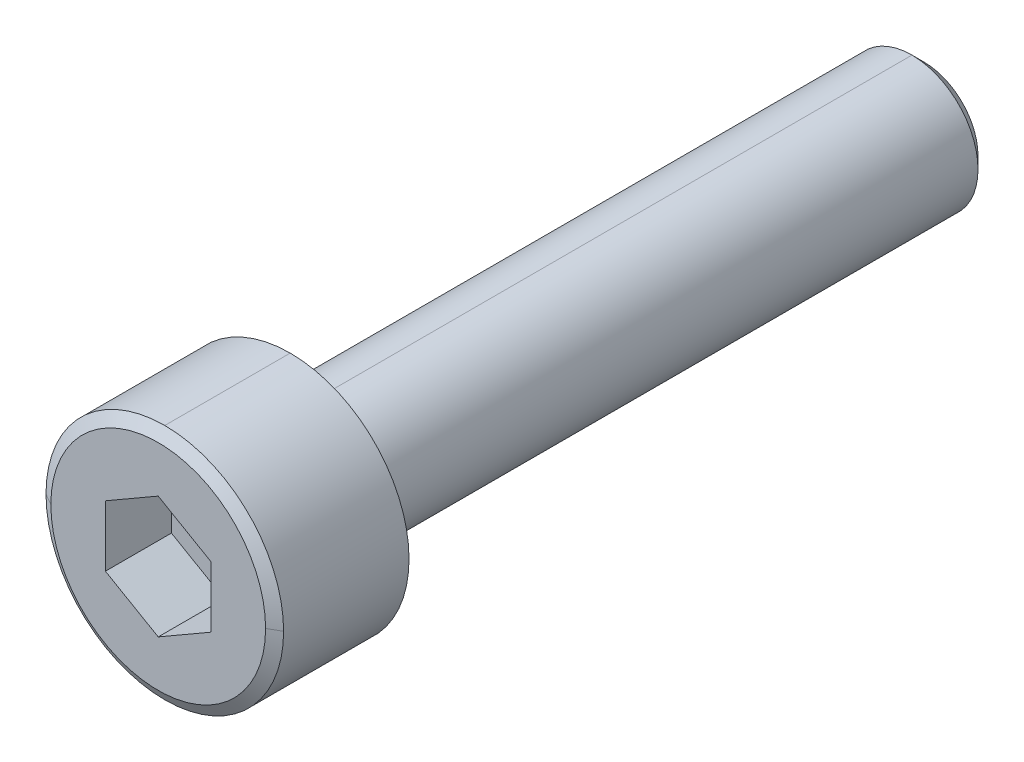
ISO-10303-21;
HEADER;
FILE_DESCRIPTION(('STEP AP214'),'2;1');
FILE_NAME('part.step','',(''),(''),'','','');
FILE_SCHEMA(('AUTOMOTIVE_DESIGN { 1 0 10303 214 1 1 1 1 }'));
ENDSEC;
DATA;
#1=APPLICATION_CONTEXT('core data for automotive mechanical design processes');
#2=APPLICATION_PROTOCOL_DEFINITION('international standard','automotive_design',2000,#1);
#3=PRODUCT_CONTEXT('',#1,'mechanical');
#4=PRODUCT('Part','Part','',(#3));
#5=PRODUCT_RELATED_PRODUCT_CATEGORY('part','',(#4));
#6=PRODUCT_DEFINITION_FORMATION('','',#4);
#7=PRODUCT_DEFINITION_CONTEXT('part definition',#1,'design');
#8=PRODUCT_DEFINITION('design','',#6,#7);
#9=PRODUCT_DEFINITION_SHAPE('','',#8);
#10=(LENGTH_UNIT() NAMED_UNIT(*) SI_UNIT(.MILLI.,.METRE.));
#11=(NAMED_UNIT(*) PLANE_ANGLE_UNIT() SI_UNIT($,.RADIAN.));
#12=(NAMED_UNIT(*) SI_UNIT($,.STERADIAN.) SOLID_ANGLE_UNIT());
#13=UNCERTAINTY_MEASURE_WITH_UNIT(LENGTH_MEASURE(1.E-05),#10,'distance_accuracy_value','');
#14=(GEOMETRIC_REPRESENTATION_CONTEXT(3) GLOBAL_UNCERTAINTY_ASSIGNED_CONTEXT((#13)) GLOBAL_UNIT_ASSIGNED_CONTEXT((#10,
#11,#12)) REPRESENTATION_CONTEXT('',''));
#15=CARTESIAN_POINT('',(0.,0.,0.));
#16=DIRECTION('',(0.,0.,1.));
#17=DIRECTION('',(1.,0.,0.));
#18=AXIS2_PLACEMENT_3D('',#15,#16,#17);
#19=CARTESIAN_POINT('',(0.,0.,1.25));
#20=DIRECTION('',(0.,0.,1.));
#21=DIRECTION('',(1.,0.,0.));
#22=AXIS2_PLACEMENT_3D('',#19,#20,#21);
#23=PLANE('',#22);
#24=DIRECTION('',(0.,-1.,0.));
#25=VECTOR('',#24,1.);
#26=CARTESIAN_POINT('',(-1.,0.5773502691896,1.25));
#27=LINE('',#26,#25);
#28=CARTESIAN_POINT('',(-1.,0.5773502691896,1.25));
#29=VERTEX_POINT('',#28);
#30=CARTESIAN_POINT('',(-1.,-0.5773502691896,1.25));
#31=VERTEX_POINT('',#30);
#32=EDGE_CURVE('E11',#29,#31,#27,.T.);
#33=ORIENTED_EDGE('',*,*,#32,.T.);
#34=DIRECTION('',(0.866025403784429,-0.500000000000017,0.));
#35=VECTOR('',#34,1.);
#36=CARTESIAN_POINT('',(-1.,-0.5773502691896,1.25));
#37=LINE('',#36,#35);
#38=CARTESIAN_POINT('',(0.,-1.154700538379,1.25));
#39=VERTEX_POINT('',#38);
#40=EDGE_CURVE('E167',#31,#39,#37,.T.);
#41=ORIENTED_EDGE('',*,*,#40,.T.);
#42=DIRECTION('',(0.866025403784429,0.500000000000017,0.));
#43=VECTOR('',#42,1.);
#44=CARTESIAN_POINT('',(0.,-1.154700538379,1.25));
#45=LINE('',#44,#43);
#46=CARTESIAN_POINT('',(1.,-0.5773502691896,1.25));
#47=VERTEX_POINT('',#46);
#48=EDGE_CURVE('E243',#39,#47,#45,.T.);
#49=ORIENTED_EDGE('',*,*,#48,.T.);
#50=DIRECTION('',(0.,1.,0.));
#51=VECTOR('',#50,1.);
#52=CARTESIAN_POINT('',(1.,-0.5773502691896,1.25));
#53=LINE('',#52,#51);
#54=CARTESIAN_POINT('',(1.,0.5773502691896,1.25));
#55=VERTEX_POINT('',#54);
#56=EDGE_CURVE('E174',#47,#55,#53,.T.);
#57=ORIENTED_EDGE('',*,*,#56,.T.);
#58=DIRECTION('',(-0.866025403784429,0.500000000000017,0.));
#59=VECTOR('',#58,1.);
#60=CARTESIAN_POINT('',(1.,0.5773502691896,1.25));
#61=LINE('',#60,#59);
#62=CARTESIAN_POINT('',(0.,1.154700538379,1.25));
#63=VERTEX_POINT('',#62);
#64=EDGE_CURVE('E163',#55,#63,#61,.T.);
#65=ORIENTED_EDGE('',*,*,#64,.T.);
#66=DIRECTION('',(-0.866025403784429,-0.500000000000017,0.));
#67=VECTOR('',#66,1.);
#68=CARTESIAN_POINT('',(0.,1.154700538379,1.25));
#69=LINE('',#68,#67);
#70=EDGE_CURVE('E164',#63,#29,#69,.T.);
#71=ORIENTED_EDGE('',*,*,#70,.T.);
#72=EDGE_LOOP('',(#33,#41,#49,#57,#65,#71));
#73=FACE_BOUND('',#72,.T.);
#74=ADVANCED_FACE('F16',(#73),#23,.T.);
#75=CARTESIAN_POINT('',(-1.,0.5773502691896,2.5));
#76=DIRECTION('',(-1.,0.,0.));
#77=DIRECTION('',(0.,0.,1.));
#78=AXIS2_PLACEMENT_3D('',#75,#76,#77);
#79=PLANE('',#78);
#80=DIRECTION('',(0.,0.,-1.));
#81=VECTOR('',#80,1.);
#82=CARTESIAN_POINT('',(-1.,-0.5773502691896,2.5));
#83=LINE('',#82,#81);
#84=CARTESIAN_POINT('',(-1.,-0.5773502691896,2.5));
#85=VERTEX_POINT('',#84);
#86=EDGE_CURVE('E27',#85,#31,#83,.T.);
#87=ORIENTED_EDGE('',*,*,#86,.T.);
#88=ORIENTED_EDGE('',*,*,#32,.F.);
#89=DIRECTION('',(0.,0.,-1.));
#90=VECTOR('',#89,1.);
#91=CARTESIAN_POINT('',(-1.,0.5773502691896,2.5));
#92=LINE('',#91,#90);
#93=CARTESIAN_POINT('',(-1.,0.5773502691896,2.5));
#94=VERTEX_POINT('',#93);
#95=EDGE_CURVE('E230',#94,#29,#92,.T.);
#96=ORIENTED_EDGE('',*,*,#95,.F.);
#97=DIRECTION('',(0.,-1.,0.));
#98=VECTOR('',#97,1.);
#99=CARTESIAN_POINT('',(-1.,0.5773502691896,2.5));
#100=LINE('',#99,#98);
#101=EDGE_CURVE('E183',#94,#85,#100,.T.);
#102=ORIENTED_EDGE('',*,*,#101,.T.);
#103=EDGE_LOOP('',(#87,#88,#96,#102));
#104=FACE_BOUND('',#103,.T.);
#105=ADVANCED_FACE('F349',(#104),#79,.F.);
#106=CARTESIAN_POINT('',(-1.,-0.5773502691896,2.5));
#107=DIRECTION('',(-0.500000000000017,-0.866025403784429,0.));
#108=DIRECTION('',(-0.866025403784429,0.500000000000017,0.));
#109=AXIS2_PLACEMENT_3D('',#106,#107,#108);
#110=PLANE('',#109);
#111=DIRECTION('',(0.,0.,-1.));
#112=VECTOR('',#111,1.);
#113=CARTESIAN_POINT('',(0.,-1.154700538379,2.5));
#114=LINE('',#113,#112);
#115=CARTESIAN_POINT('',(0.,-1.154700538379,2.5));
#116=VERTEX_POINT('',#115);
#117=EDGE_CURVE('E246',#116,#39,#114,.T.);
#118=ORIENTED_EDGE('',*,*,#117,.T.);
#119=ORIENTED_EDGE('',*,*,#40,.F.);
#120=ORIENTED_EDGE('',*,*,#86,.F.);
#121=DIRECTION('',(0.866025403784429,-0.500000000000017,0.));
#122=VECTOR('',#121,1.);
#123=CARTESIAN_POINT('',(-1.,-0.5773502691896,2.5));
#124=LINE('',#123,#122);
#125=EDGE_CURVE('E179',#85,#116,#124,.T.);
#126=ORIENTED_EDGE('',*,*,#125,.T.);
#127=EDGE_LOOP('',(#118,#119,#120,#126));
#128=FACE_BOUND('',#127,.T.);
#129=ADVANCED_FACE('F354',(#128),#110,.F.);
#130=CARTESIAN_POINT('',(0.,-1.154700538379,2.5));
#131=DIRECTION('',(0.500000000000017,-0.866025403784429,0.));
#132=DIRECTION('',(0.,0.,-1.));
#133=AXIS2_PLACEMENT_3D('',#130,#131,#132);
#134=PLANE('',#133);
#135=DIRECTION('',(0.,0.,-1.));
#136=VECTOR('',#135,1.);
#137=CARTESIAN_POINT('',(1.,-0.5773502691896,2.5));
#138=LINE('',#137,#136);
#139=CARTESIAN_POINT('',(1.,-0.5773502691896,2.5));
#140=VERTEX_POINT('',#139);
#141=EDGE_CURVE('E177',#140,#47,#138,.T.);
#142=ORIENTED_EDGE('',*,*,#141,.T.);
#143=ORIENTED_EDGE('',*,*,#48,.F.);
#144=ORIENTED_EDGE('',*,*,#117,.F.);
#145=DIRECTION('',(0.866025403784429,0.500000000000017,0.));
#146=VECTOR('',#145,1.);
#147=CARTESIAN_POINT('',(0.,-1.154700538379,2.5));
#148=LINE('',#147,#146);
#149=EDGE_CURVE('E158',#116,#140,#148,.T.);
#150=ORIENTED_EDGE('',*,*,#149,.T.);
#151=EDGE_LOOP('',(#142,#143,#144,#150));
#152=FACE_BOUND('',#151,.T.);
#153=ADVANCED_FACE('F362',(#152),#134,.F.);
#154=CARTESIAN_POINT('',(1.,-0.5773502691896,2.5));
#155=DIRECTION('',(1.,0.,0.));
#156=DIRECTION('',(0.,1.,0.));
#157=AXIS2_PLACEMENT_3D('',#154,#155,#156);
#158=PLANE('',#157);
#159=DIRECTION('',(0.,0.,-1.));
#160=VECTOR('',#159,1.);
#161=CARTESIAN_POINT('',(1.,0.5773502691896,2.5));
#162=LINE('',#161,#160);
#163=CARTESIAN_POINT('',(1.,0.5773502691896,2.5));
#164=VERTEX_POINT('',#163);
#165=EDGE_CURVE('E178',#164,#55,#162,.T.);
#166=ORIENTED_EDGE('',*,*,#165,.T.);
#167=ORIENTED_EDGE('',*,*,#56,.F.);
#168=ORIENTED_EDGE('',*,*,#141,.F.);
#169=DIRECTION('',(0.,1.,0.));
#170=VECTOR('',#169,1.);
#171=CARTESIAN_POINT('',(1.,-0.5773502691896,2.5));
#172=LINE('',#171,#170);
#173=EDGE_CURVE('E286',#140,#164,#172,.T.);
#174=ORIENTED_EDGE('',*,*,#173,.T.);
#175=EDGE_LOOP('',(#166,#167,#168,#174));
#176=FACE_BOUND('',#175,.T.);
#177=ADVANCED_FACE('F359',(#176),#158,.F.);
#178=CARTESIAN_POINT('',(1.,0.5773502691896,2.5));
#179=DIRECTION('',(0.500000000000017,0.866025403784429,0.));
#180=DIRECTION('',(0.,0.,-1.));
#181=AXIS2_PLACEMENT_3D('',#178,#179,#180);
#182=PLANE('',#181);
#183=DIRECTION('',(0.,0.,-1.));
#184=VECTOR('',#183,1.);
#185=CARTESIAN_POINT('',(0.,1.154700538379,2.5));
#186=LINE('',#185,#184);
#187=CARTESIAN_POINT('',(0.,1.154700538379,2.5));
#188=VERTEX_POINT('',#187);
#189=EDGE_CURVE('E160',#188,#63,#186,.T.);
#190=ORIENTED_EDGE('',*,*,#189,.T.);
#191=ORIENTED_EDGE('',*,*,#64,.F.);
#192=ORIENTED_EDGE('',*,*,#165,.F.);
#193=DIRECTION('',(-0.866025403784429,0.500000000000017,0.));
#194=VECTOR('',#193,1.);
#195=CARTESIAN_POINT('',(1.,0.5773502691896,2.5));
#196=LINE('',#195,#194);
#197=EDGE_CURVE('E249',#164,#188,#196,.T.);
#198=ORIENTED_EDGE('',*,*,#197,.T.);
#199=EDGE_LOOP('',(#190,#191,#192,#198));
#200=FACE_BOUND('',#199,.T.);
#201=ADVANCED_FACE('F299',(#200),#182,.F.);
#202=CARTESIAN_POINT('',(0.,1.154700538379,2.5));
#203=DIRECTION('',(-0.500000000000017,0.866025403784429,0.));
#204=DIRECTION('',(0.,0.,1.));
#205=AXIS2_PLACEMENT_3D('',#202,#203,#204);
#206=PLANE('',#205);
#207=ORIENTED_EDGE('',*,*,#95,.T.);
#208=ORIENTED_EDGE('',*,*,#70,.F.);
#209=ORIENTED_EDGE('',*,*,#189,.F.);
#210=DIRECTION('',(-0.866025403784429,-0.500000000000017,0.));
#211=VECTOR('',#210,1.);
#212=CARTESIAN_POINT('',(0.,1.154700538379,2.5));
#213=LINE('',#212,#211);
#214=EDGE_CURVE('E187',#188,#94,#213,.T.);
#215=ORIENTED_EDGE('',*,*,#214,.T.);
#216=EDGE_LOOP('',(#207,#208,#209,#215));
#217=FACE_BOUND('',#216,.T.);
#218=ADVANCED_FACE('F303',(#217),#206,.F.);
#219=CARTESIAN_POINT('',(0.,0.,2.5));
#220=DIRECTION('',(0.,0.,-1.));
#221=DIRECTION('',(0.,-1.,0.));
#222=AXIS2_PLACEMENT_3D('',#219,#220,#221);
#223=PLANE('',#222);
#224=ORIENTED_EDGE('',*,*,#197,.F.);
#225=ORIENTED_EDGE('',*,*,#173,.F.);
#226=ORIENTED_EDGE('',*,*,#149,.F.);
#227=ORIENTED_EDGE('',*,*,#125,.F.);
#228=ORIENTED_EDGE('',*,*,#101,.F.);
#229=ORIENTED_EDGE('',*,*,#214,.F.);
#230=EDGE_LOOP('',(#224,#225,#226,#227,#228,#229));
#231=FACE_BOUND('',#230,.T.);
#232=CARTESIAN_POINT('',(0.,0.,2.5));
#233=DIRECTION('',(0.,0.,1.));
#234=DIRECTION('',(1.,0.,0.));
#235=AXIS2_PLACEMENT_3D('',#232,#233,#234);
#236=CIRCLE('',#235,2.033493649054);
#237=CARTESIAN_POINT('',(2.033493649054,0.,2.5));
#238=VERTEX_POINT('',#237);
#239=CARTESIAN_POINT('',(-2.033493649054,0.,2.5));
#240=VERTEX_POINT('',#239);
#241=EDGE_CURVE('E211',#238,#240,#236,.T.);
#242=ORIENTED_EDGE('',*,*,#241,.T.);
#243=CARTESIAN_POINT('',(0.,0.,2.5));
#244=DIRECTION('',(0.,0.,1.));
#245=DIRECTION('',(-1.,0.,0.));
#246=AXIS2_PLACEMENT_3D('',#243,#244,#245);
#247=CIRCLE('',#246,2.033493649054);
#248=EDGE_CURVE('E188',#240,#238,#247,.T.);
#249=ORIENTED_EDGE('',*,*,#248,.T.);
#250=EDGE_LOOP('',(#242,#249));
#251=FACE_BOUND('',#250,.T.);
#252=ADVANCED_FACE('F343',(#231,#251),#223,.F.);
#253=CARTESIAN_POINT('',(0.,0.,2.4375));
#254=DIRECTION('',(0.,0.,-1.));
#255=DIRECTION('',(1.,0.,0.));
#256=AXIS2_PLACEMENT_3D('',#253,#254,#255);
#257=CONICAL_SURFACE('',#256,2.141746824527,1.0471975511964);
#258=CARTESIAN_POINT('',(0.,0.,2.375));
#259=DIRECTION('',(0.,0.,-1.));
#260=DIRECTION('',(-1.,0.,0.));
#261=AXIS2_PLACEMENT_3D('',#258,#259,#260);
#262=CIRCLE('',#261,2.25);
#263=CARTESIAN_POINT('',(-2.25,0.,2.375));
#264=VERTEX_POINT('',#263);
#265=CARTESIAN_POINT('',(0.,2.25,2.375));
#266=VERTEX_POINT('',#265);
#267=EDGE_CURVE('E242',#264,#266,#262,.T.);
#268=ORIENTED_EDGE('',*,*,#267,.F.);
#269=DIRECTION('',(-0.866025403784429,0.,-0.500000000000017));
#270=VECTOR('',#269,1.);
#271=CARTESIAN_POINT('',(-2.033493649054,0.,2.5));
#272=LINE('',#271,#270);
#273=EDGE_CURVE('E192',#240,#264,#272,.T.);
#274=ORIENTED_EDGE('',*,*,#273,.F.);
#275=ORIENTED_EDGE('',*,*,#241,.F.);
#276=DIRECTION('',(0.866025403784429,0.,-0.500000000000017));
#277=VECTOR('',#276,1.);
#278=CARTESIAN_POINT('',(2.033493649054,0.,2.5));
#279=LINE('',#278,#277);
#280=CARTESIAN_POINT('',(2.25,0.,2.375));
#281=VERTEX_POINT('',#280);
#282=EDGE_CURVE('E193',#238,#281,#279,.T.);
#283=ORIENTED_EDGE('',*,*,#282,.T.);
#284=CARTESIAN_POINT('',(0.,0.,2.375));
#285=DIRECTION('',(0.,0.,-1.));
#286=DIRECTION('',(0.,1.,0.));
#287=AXIS2_PLACEMENT_3D('',#284,#285,#286);
#288=CIRCLE('',#287,2.25);
#289=EDGE_CURVE('E203',#266,#281,#288,.T.);
#290=ORIENTED_EDGE('',*,*,#289,.F.);
#291=EDGE_LOOP('',(#268,#274,#275,#283,#290));
#292=FACE_BOUND('',#291,.T.);
#293=ADVANCED_FACE('F335',(#292),#257,.T.);
#294=CARTESIAN_POINT('',(0.,0.,3.225));
#295=DIRECTION('',(0.,0.,-1.));
#296=DIRECTION('',(0.,-1.,0.));
#297=AXIS2_PLACEMENT_3D('',#294,#295,#296);
#298=CYLINDRICAL_SURFACE('',#297,2.25);
#299=DIRECTION('',(0.,0.,1.));
#300=VECTOR('',#299,1.);
#301=CARTESIAN_POINT('',(0.,-2.25,0.));
#302=LINE('',#301,#300);
#303=CARTESIAN_POINT('',(0.,-2.25,0.));
#304=VERTEX_POINT('',#303);
#305=CARTESIAN_POINT('',(0.,-2.25,2.375));
#306=VERTEX_POINT('',#305);
#307=EDGE_CURVE('E236',#304,#306,#302,.T.);
#308=ORIENTED_EDGE('',*,*,#307,.F.);
#309=CARTESIAN_POINT('',(0.,0.,0.));
#310=DIRECTION('',(0.,0.,-1.));
#311=DIRECTION('',(0.,1.,0.));
#312=AXIS2_PLACEMENT_3D('',#309,#310,#311);
#313=CIRCLE('',#312,2.25);
#314=CARTESIAN_POINT('',(0.,2.25,0.));
#315=VERTEX_POINT('',#314);
#316=EDGE_CURVE('E265',#315,#304,#313,.T.);
#317=ORIENTED_EDGE('',*,*,#316,.F.);
#318=DIRECTION('',(0.,0.,1.));
#319=VECTOR('',#318,1.);
#320=CARTESIAN_POINT('',(0.,2.25,0.));
#321=LINE('',#320,#319);
#322=EDGE_CURVE('E238',#315,#266,#321,.T.);
#323=ORIENTED_EDGE('',*,*,#322,.T.);
#324=ORIENTED_EDGE('',*,*,#289,.T.);
#325=CARTESIAN_POINT('',(0.,0.,2.375));
#326=DIRECTION('',(0.,0.,-1.));
#327=DIRECTION('',(1.,0.,0.));
#328=AXIS2_PLACEMENT_3D('',#325,#326,#327);
#329=CIRCLE('',#328,2.25);
#330=EDGE_CURVE('E200',#281,#306,#329,.T.);
#331=ORIENTED_EDGE('',*,*,#330,.T.);
#332=EDGE_LOOP('',(#308,#317,#323,#324,#331));
#333=FACE_BOUND('',#332,.T.);
#334=ADVANCED_FACE('F332',(#333),#298,.T.);
#335=CARTESIAN_POINT('',(0.,0.,2.4375));
#336=DIRECTION('',(0.,0.,-1.));
#337=DIRECTION('',(1.,0.,0.));
#338=AXIS2_PLACEMENT_3D('',#335,#336,#337);
#339=CONICAL_SURFACE('',#338,2.141746824527,1.0471975511964);
#340=ORIENTED_EDGE('',*,*,#282,.F.);
#341=ORIENTED_EDGE('',*,*,#248,.F.);
#342=ORIENTED_EDGE('',*,*,#273,.T.);
#343=CARTESIAN_POINT('',(0.,0.,2.375));
#344=DIRECTION('',(0.,0.,-1.));
#345=DIRECTION('',(0.,-1.,0.));
#346=AXIS2_PLACEMENT_3D('',#343,#344,#345);
#347=CIRCLE('',#346,2.25);
#348=EDGE_CURVE('E234',#306,#264,#347,.T.);
#349=ORIENTED_EDGE('',*,*,#348,.F.);
#350=ORIENTED_EDGE('',*,*,#330,.F.);
#351=EDGE_LOOP('',(#340,#341,#342,#349,#350));
#352=FACE_BOUND('',#351,.T.);
#353=ADVANCED_FACE('F334',(#352),#339,.T.);
#354=CARTESIAN_POINT('',(0.,0.,3.225));
#355=DIRECTION('',(0.,0.,-1.));
#356=DIRECTION('',(0.,-1.,0.));
#357=AXIS2_PLACEMENT_3D('',#354,#355,#356);
#358=CYLINDRICAL_SURFACE('',#357,2.25);
#359=ORIENTED_EDGE('',*,*,#267,.T.);
#360=ORIENTED_EDGE('',*,*,#322,.F.);
#361=CARTESIAN_POINT('',(0.,0.,0.));
#362=DIRECTION('',(0.,0.,1.));
#363=DIRECTION('',(0.,1.,0.));
#364=AXIS2_PLACEMENT_3D('',#361,#362,#363);
#365=CIRCLE('',#364,2.25);
#366=EDGE_CURVE('E276',#315,#304,#365,.T.);
#367=ORIENTED_EDGE('',*,*,#366,.T.);
#368=ORIENTED_EDGE('',*,*,#307,.T.);
#369=ORIENTED_EDGE('',*,*,#348,.T.);
#370=EDGE_LOOP('',(#359,#360,#367,#368,#369));
#371=FACE_BOUND('',#370,.T.);
#372=ADVANCED_FACE('F270',(#371),#358,.T.);
#373=CARTESIAN_POINT('',(0.,0.,0.));
#374=DIRECTION('',(0.,0.,-1.));
#375=DIRECTION('',(0.,-1.,0.));
#376=AXIS2_PLACEMENT_3D('',#373,#374,#375);
#377=PLANE('',#376);
#378=CARTESIAN_POINT('',(0.,0.,0.));
#379=DIRECTION('',(0.,0.,1.));
#380=DIRECTION('',(0.,1.,0.));
#381=AXIS2_PLACEMENT_3D('',#378,#379,#380);
#382=CIRCLE('',#381,1.25);
#383=CARTESIAN_POINT('',(0.,1.25,0.));
#384=VERTEX_POINT('',#383);
#385=CARTESIAN_POINT('',(0.,-1.25,0.));
#386=VERTEX_POINT('',#385);
#387=EDGE_CURVE('E171',#384,#386,#382,.T.);
#388=ORIENTED_EDGE('',*,*,#387,.T.);
#389=CARTESIAN_POINT('',(0.,0.,0.));
#390=DIRECTION('',(0.,0.,-1.));
#391=DIRECTION('',(0.,1.,0.));
#392=AXIS2_PLACEMENT_3D('',#389,#390,#391);
#393=CIRCLE('',#392,1.25);
#394=EDGE_CURVE('E172',#384,#386,#393,.T.);
#395=ORIENTED_EDGE('',*,*,#394,.F.);
#396=EDGE_LOOP('',(#388,#395));
#397=FACE_BOUND('',#396,.T.);
#398=ORIENTED_EDGE('',*,*,#316,.T.);
#399=ORIENTED_EDGE('',*,*,#366,.F.);
#400=EDGE_LOOP('',(#398,#399));
#401=FACE_BOUND('',#400,.T.);
#402=ADVANCED_FACE('F267',(#397,#401),#377,.T.);
#403=CARTESIAN_POINT('',(0.,0.,3.225));
#404=DIRECTION('',(0.,0.,-1.));
#405=DIRECTION('',(0.,-1.,0.));
#406=AXIS2_PLACEMENT_3D('',#403,#404,#405);
#407=CYLINDRICAL_SURFACE('',#406,1.25);
#408=DIRECTION('',(0.,0.,1.));
#409=VECTOR('',#408,1.);
#410=CARTESIAN_POINT('',(0.,-1.25,-11.775));
#411=LINE('',#410,#409);
#412=CARTESIAN_POINT('',(0.,-1.25,-11.775));
#413=VERTEX_POINT('',#412);
#414=EDGE_CURVE('E168',#413,#386,#411,.T.);
#415=ORIENTED_EDGE('',*,*,#414,.T.);
#416=ORIENTED_EDGE('',*,*,#387,.F.);
#417=DIRECTION('',(0.,0.,1.));
#418=VECTOR('',#417,1.);
#419=CARTESIAN_POINT('',(0.,1.25,-11.775));
#420=LINE('',#419,#418);
#421=CARTESIAN_POINT('',(0.,1.25,-11.775));
#422=VERTEX_POINT('',#421);
#423=EDGE_CURVE('E199',#422,#384,#420,.T.);
#424=ORIENTED_EDGE('',*,*,#423,.F.);
#425=CARTESIAN_POINT('',(0.,0.,-11.775));
#426=DIRECTION('',(0.,0.,-1.));
#427=DIRECTION('',(-1.,0.,0.));
#428=AXIS2_PLACEMENT_3D('',#425,#426,#427);
#429=CIRCLE('',#428,1.25);
#430=CARTESIAN_POINT('',(-1.25,0.,-11.775));
#431=VERTEX_POINT('',#430);
#432=EDGE_CURVE('E226',#431,#422,#429,.T.);
#433=ORIENTED_EDGE('',*,*,#432,.F.);
#434=CARTESIAN_POINT('',(0.,0.,-11.775));
#435=DIRECTION('',(0.,0.,-1.));
#436=DIRECTION('',(0.,-1.,0.));
#437=AXIS2_PLACEMENT_3D('',#434,#435,#436);
#438=CIRCLE('',#437,1.25);
#439=EDGE_CURVE('E231',#413,#431,#438,.T.);
#440=ORIENTED_EDGE('',*,*,#439,.F.);
#441=EDGE_LOOP('',(#415,#416,#424,#433,#440));
#442=FACE_BOUND('',#441,.T.);
#443=ADVANCED_FACE('F260',(#442),#407,.T.);
#444=CARTESIAN_POINT('',(0.,0.,3.225));
#445=DIRECTION('',(0.,0.,-1.));
#446=DIRECTION('',(0.,-1.,0.));
#447=AXIS2_PLACEMENT_3D('',#444,#445,#446);
#448=CYLINDRICAL_SURFACE('',#447,1.25);
#449=CARTESIAN_POINT('',(0.,0.,-11.775));
#450=DIRECTION('',(0.,0.,-1.));
#451=DIRECTION('',(0.,1.,0.));
#452=AXIS2_PLACEMENT_3D('',#449,#450,#451);
#453=CIRCLE('',#452,1.25);
#454=CARTESIAN_POINT('',(1.25,0.,-11.775));
#455=VERTEX_POINT('',#454);
#456=EDGE_CURVE('E137',#422,#455,#453,.T.);
#457=ORIENTED_EDGE('',*,*,#456,.F.);
#458=ORIENTED_EDGE('',*,*,#423,.T.);
#459=ORIENTED_EDGE('',*,*,#394,.T.);
#460=ORIENTED_EDGE('',*,*,#414,.F.);
#461=CARTESIAN_POINT('',(0.,0.,-11.775));
#462=DIRECTION('',(0.,0.,-1.));
#463=DIRECTION('',(1.,0.,0.));
#464=AXIS2_PLACEMENT_3D('',#461,#462,#463);
#465=CIRCLE('',#464,1.25);
#466=EDGE_CURVE('E142',#455,#413,#465,.T.);
#467=ORIENTED_EDGE('',*,*,#466,.F.);
#468=EDGE_LOOP('',(#457,#458,#459,#460,#467));
#469=FACE_BOUND('',#468,.T.);
#470=ADVANCED_FACE('F256',(#469),#448,.T.);
#471=CARTESIAN_POINT('',(0.,0.,-11.8875));
#472=DIRECTION('',(0.,0.,1.));
#473=DIRECTION('',(-1.,0.,0.));
#474=AXIS2_PLACEMENT_3D('',#471,#472,#473);
#475=CONICAL_SURFACE('',#474,1.1375,0.7853981633973);
#476=DIRECTION('',(0.707106781186548,0.,-0.707106781186548));
#477=VECTOR('',#476,1.);
#478=CARTESIAN_POINT('',(-1.25,0.,-11.775));
#479=LINE('',#478,#477);
#480=CARTESIAN_POINT('',(-1.025,0.,-12.));
#481=VERTEX_POINT('',#480);
#482=EDGE_CURVE('E20',#431,#481,#479,.T.);
#483=ORIENTED_EDGE('',*,*,#482,.F.);
#484=ORIENTED_EDGE('',*,*,#432,.T.);
#485=ORIENTED_EDGE('',*,*,#456,.T.);
#486=DIRECTION('',(-0.707106781186548,0.,-0.707106781186548));
#487=VECTOR('',#486,1.);
#488=CARTESIAN_POINT('',(1.25,0.,-11.775));
#489=LINE('',#488,#487);
#490=CARTESIAN_POINT('',(1.025,0.,-12.));
#491=VERTEX_POINT('',#490);
#492=EDGE_CURVE('E129',#455,#491,#489,.T.);
#493=ORIENTED_EDGE('',*,*,#492,.T.);
#494=CARTESIAN_POINT('',(0.,0.,-12.));
#495=DIRECTION('',(0.,0.,1.));
#496=DIRECTION('',(1.,0.,0.));
#497=AXIS2_PLACEMENT_3D('',#494,#495,#496);
#498=CIRCLE('',#497,1.025);
#499=EDGE_CURVE('E134',#491,#481,#498,.T.);
#500=ORIENTED_EDGE('',*,*,#499,.T.);
#501=EDGE_LOOP('',(#483,#484,#485,#493,#500));
#502=FACE_BOUND('',#501,.T.);
#503=ADVANCED_FACE('F132',(#502),#475,.T.);
#504=CARTESIAN_POINT('',(0.,0.,-11.8875));
#505=DIRECTION('',(0.,0.,1.));
#506=DIRECTION('',(-1.,0.,0.));
#507=AXIS2_PLACEMENT_3D('',#504,#505,#506);
#508=CONICAL_SURFACE('',#507,1.1375,0.7853981633973);
#509=ORIENTED_EDGE('',*,*,#492,.F.);
#510=ORIENTED_EDGE('',*,*,#466,.T.);
#511=ORIENTED_EDGE('',*,*,#439,.T.);
#512=ORIENTED_EDGE('',*,*,#482,.T.);
#513=CARTESIAN_POINT('',(0.,0.,-12.));
#514=DIRECTION('',(0.,0.,1.));
#515=DIRECTION('',(-1.,0.,0.));
#516=AXIS2_PLACEMENT_3D('',#513,#514,#515);
#517=CIRCLE('',#516,1.025);
#518=EDGE_CURVE('E143',#481,#491,#517,.T.);
#519=ORIENTED_EDGE('',*,*,#518,.T.);
#520=EDGE_LOOP('',(#509,#510,#511,#512,#519));
#521=FACE_BOUND('',#520,.T.);
#522=ADVANCED_FACE('F146',(#521),#508,.T.);
#523=CARTESIAN_POINT('',(0.,0.,-12.));
#524=DIRECTION('',(0.,0.,-1.));
#525=DIRECTION('',(0.,-1.,0.));
#526=AXIS2_PLACEMENT_3D('',#523,#524,#525);
#527=PLANE('',#526);
#528=ORIENTED_EDGE('',*,*,#499,.F.);
#529=ORIENTED_EDGE('',*,*,#518,.F.);
#530=EDGE_LOOP('',(#528,#529));
#531=FACE_BOUND('',#530,.T.);
#532=ADVANCED_FACE('F18',(#531),#527,.T.);
#533=CLOSED_SHELL('',(#74,#105,#129,#153,#177,#201,#218,#252,#293,#334,#353,#372,#402,#443,#470,
#503,#522,#532));
#534=MANIFOLD_SOLID_BREP('B1',#533);
#535=ADVANCED_BREP_SHAPE_REPRESENTATION('',(#18,#534),#14);
#536=SHAPE_DEFINITION_REPRESENTATION(#9,#535);
ENDSEC;
END-ISO-10303-21;
